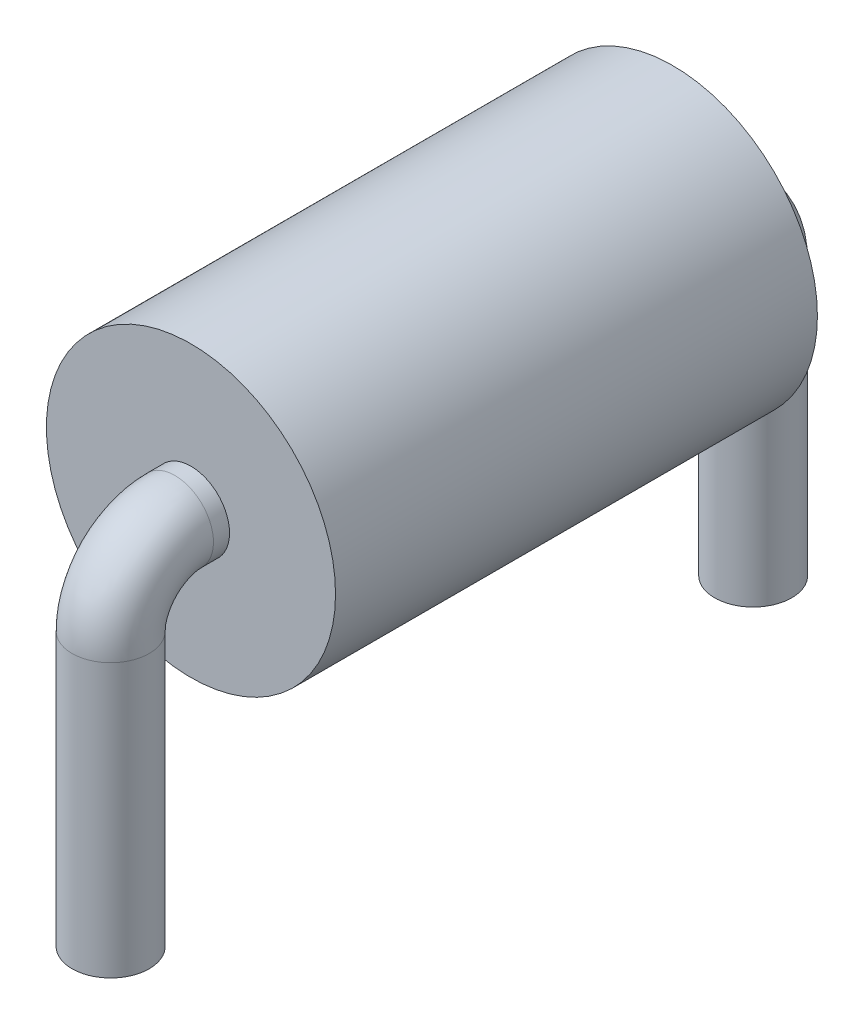
ISO-10303-21;
HEADER;
FILE_DESCRIPTION(('STEP AP214'),'2;1');
FILE_NAME('part.step','',(''),(''),'','','');
FILE_SCHEMA(('AUTOMOTIVE_DESIGN { 1 0 10303 214 1 1 1 1 }'));
ENDSEC;
DATA;
#1=APPLICATION_CONTEXT('core data for automotive mechanical design processes');
#2=APPLICATION_PROTOCOL_DEFINITION('international standard','automotive_design',2000,#1);
#3=PRODUCT_CONTEXT('',#1,'mechanical');
#4=PRODUCT('Part','Part','',(#3));
#5=PRODUCT_RELATED_PRODUCT_CATEGORY('part','',(#4));
#6=PRODUCT_DEFINITION_FORMATION('','',#4);
#7=PRODUCT_DEFINITION_CONTEXT('part definition',#1,'design');
#8=PRODUCT_DEFINITION('design','',#6,#7);
#9=PRODUCT_DEFINITION_SHAPE('','',#8);
#10=(LENGTH_UNIT() NAMED_UNIT(*) SI_UNIT(.MILLI.,.METRE.));
#11=(NAMED_UNIT(*) PLANE_ANGLE_UNIT() SI_UNIT($,.RADIAN.));
#12=(NAMED_UNIT(*) SI_UNIT($,.STERADIAN.) SOLID_ANGLE_UNIT());
#13=UNCERTAINTY_MEASURE_WITH_UNIT(LENGTH_MEASURE(1.E-05),#10,'distance_accuracy_value','');
#14=(GEOMETRIC_REPRESENTATION_CONTEXT(3) GLOBAL_UNCERTAINTY_ASSIGNED_CONTEXT((#13)) GLOBAL_UNIT_ASSIGNED_CONTEXT((#10,
#11,#12)) REPRESENTATION_CONTEXT('',''));
#15=CARTESIAN_POINT('',(0.,0.,0.));
#16=DIRECTION('',(0.,0.,1.));
#17=DIRECTION('',(1.,0.,0.));
#18=AXIS2_PLACEMENT_3D('',#15,#16,#17);
#19=CARTESIAN_POINT('',(0.,-5.25,-5.));
#20=DIRECTION('',(0.,1.,0.));
#21=DIRECTION('',(0.,0.,1.));
#22=AXIS2_PLACEMENT_3D('',#19,#20,#21);
#23=CYLINDRICAL_SURFACE('',#22,0.6);
#24=CARTESIAN_POINT('',(0.,-5.25,-5.));
#25=DIRECTION('',(0.,-1.,0.));
#26=DIRECTION('',(0.,0.,-1.));
#27=AXIS2_PLACEMENT_3D('',#24,#25,#26);
#28=CIRCLE('',#27,0.6);
#29=CARTESIAN_POINT('',(0.,-5.25,-5.6));
#30=VERTEX_POINT('',#29);
#31=EDGE_CURVE('E10',#30,#30,#28,.T.);
#32=ORIENTED_EDGE('',*,*,#31,.F.);
#33=EDGE_LOOP('',(#32));
#34=FACE_BOUND('',#33,.T.);
#35=CARTESIAN_POINT('',(0.,-1.,-5.));
#36=DIRECTION('',(0.,-1.,0.));
#37=DIRECTION('',(-1.,0.,0.));
#38=AXIS2_PLACEMENT_3D('',#35,#36,#37);
#39=CIRCLE('',#38,0.6);
#40=CARTESIAN_POINT('',(0.,-1.,-5.6));
#41=VERTEX_POINT('',#40);
#42=EDGE_CURVE('E39',#41,#41,#39,.T.);
#43=ORIENTED_EDGE('',*,*,#42,.T.);
#44=EDGE_LOOP('',(#43));
#45=FACE_BOUND('',#44,.T.);
#46=ADVANCED_FACE('F33',(#34,#45),#23,.T.);
#47=CARTESIAN_POINT('',(0.,-5.25,-5.));
#48=DIRECTION('',(0.,-1.,0.));
#49=DIRECTION('',(0.,0.,-1.));
#50=AXIS2_PLACEMENT_3D('',#47,#48,#49);
#51=PLANE('',#50);
#52=ORIENTED_EDGE('',*,*,#31,.T.);
#53=EDGE_LOOP('',(#52));
#54=FACE_BOUND('',#53,.T.);
#55=ADVANCED_FACE('F92',(#54),#51,.T.);
#56=CARTESIAN_POINT('',(0.,0.,-3.75));
#57=DIRECTION('',(0.,0.,-1.));
#58=DIRECTION('',(-1.,0.,0.));
#59=AXIS2_PLACEMENT_3D('',#56,#57,#58);
#60=CYLINDRICAL_SURFACE('',#59,0.6);
#61=CARTESIAN_POINT('',(0.,0.,-4.));
#62=DIRECTION('',(0.,0.,-1.));
#63=DIRECTION('',(-1.,0.,0.));
#64=AXIS2_PLACEMENT_3D('',#61,#62,#63);
#65=CIRCLE('',#64,0.6);
#66=CARTESIAN_POINT('',(0.,0.6,-4.));
#67=VERTEX_POINT('',#66);
#68=EDGE_CURVE('E43',#67,#67,#65,.T.);
#69=ORIENTED_EDGE('',*,*,#68,.F.);
#70=EDGE_LOOP('',(#69));
#71=FACE_BOUND('',#70,.T.);
#72=CARTESIAN_POINT('',(0.,0.,-3.75));
#73=DIRECTION('',(0.,0.,-1.));
#74=DIRECTION('',(-1.,0.,0.));
#75=AXIS2_PLACEMENT_3D('',#72,#73,#74);
#76=CIRCLE('',#75,0.6);
#77=CARTESIAN_POINT('',(-0.6,0.,-3.75));
#78=VERTEX_POINT('',#77);
#79=EDGE_CURVE('E47',#78,#78,#76,.T.);
#80=ORIENTED_EDGE('',*,*,#79,.T.);
#81=EDGE_LOOP('',(#80));
#82=FACE_BOUND('',#81,.T.);
#83=ADVANCED_FACE('F97',(#71,#82),#60,.T.);
#84=CARTESIAN_POINT('',(0.,-1.,-4.));
#85=DIRECTION('',(-1.,0.,0.));
#86=DIRECTION('',(0.,0.,1.));
#87=AXIS2_PLACEMENT_3D('',#84,#85,#86);
#88=TOROIDAL_SURFACE('',#87,1.,0.6);
#89=CARTESIAN_POINT('',(0.,-1.,-4.));
#90=DIRECTION('',(-1.,0.,0.));
#91=DIRECTION('',(0.,0.,1.));
#92=AXIS2_PLACEMENT_3D('',#89,#90,#91);
#93=CIRCLE('',#92,1.6);
#94=EDGE_CURVE('',#67,#41,#93,.T.);
#95=ORIENTED_EDGE('',*,*,#68,.T.);
#96=ORIENTED_EDGE('',*,*,#42,.F.);
#97=ORIENTED_EDGE('',*,*,#94,.T.);
#98=ORIENTED_EDGE('',*,*,#94,.F.);
#99=EDGE_LOOP('',(#95,#97,#96,#98));
#100=FACE_BOUND('',#99,.T.);
#101=ADVANCED_FACE('F98',(#100),#88,.T.);
#102=CARTESIAN_POINT('',(0.,0.,3.75));
#103=DIRECTION('',(0.,0.,-1.));
#104=DIRECTION('',(-1.,0.,0.));
#105=AXIS2_PLACEMENT_3D('',#102,#103,#104);
#106=CYLINDRICAL_SURFACE('',#105,2.25);
#107=CARTESIAN_POINT('',(0.,0.,3.75));
#108=DIRECTION('',(0.,0.,1.));
#109=DIRECTION('',(1.,0.,0.));
#110=AXIS2_PLACEMENT_3D('',#107,#108,#109);
#111=CIRCLE('',#110,2.25);
#112=CARTESIAN_POINT('',(2.25,0.,3.75));
#113=VERTEX_POINT('',#112);
#114=EDGE_CURVE('E56',#113,#113,#111,.T.);
#115=ORIENTED_EDGE('',*,*,#114,.F.);
#116=EDGE_LOOP('',(#115));
#117=FACE_BOUND('',#116,.T.);
#118=CARTESIAN_POINT('',(0.,0.,-3.75));
#119=DIRECTION('',(0.,0.,1.));
#120=DIRECTION('',(1.,0.,0.));
#121=AXIS2_PLACEMENT_3D('',#118,#119,#120);
#122=CIRCLE('',#121,2.25);
#123=CARTESIAN_POINT('',(2.25,0.,-3.75));
#124=VERTEX_POINT('',#123);
#125=EDGE_CURVE('E53',#124,#124,#122,.T.);
#126=ORIENTED_EDGE('',*,*,#125,.T.);
#127=EDGE_LOOP('',(#126));
#128=FACE_BOUND('',#127,.T.);
#129=ADVANCED_FACE('F104',(#117,#128),#106,.T.);
#130=CARTESIAN_POINT('',(0.,0.,3.75));
#131=DIRECTION('',(0.,0.,1.));
#132=DIRECTION('',(1.,0.,0.));
#133=AXIS2_PLACEMENT_3D('',#130,#131,#132);
#134=PLANE('',#133);
#135=CARTESIAN_POINT('',(0.,0.,3.75));
#136=DIRECTION('',(0.,0.,1.));
#137=DIRECTION('',(1.,0.,0.));
#138=AXIS2_PLACEMENT_3D('',#135,#136,#137);
#139=CIRCLE('',#138,0.6);
#140=CARTESIAN_POINT('',(0.6,0.,3.75));
#141=VERTEX_POINT('',#140);
#142=EDGE_CURVE('E52',#141,#141,#139,.T.);
#143=ORIENTED_EDGE('',*,*,#142,.F.);
#144=EDGE_LOOP('',(#143));
#145=FACE_BOUND('',#144,.T.);
#146=ORIENTED_EDGE('',*,*,#114,.T.);
#147=EDGE_LOOP('',(#146));
#148=FACE_BOUND('',#147,.T.);
#149=ADVANCED_FACE('F86',(#145,#148),#134,.T.);
#150=CARTESIAN_POINT('',(0.,0.,-3.75));
#151=DIRECTION('',(0.,0.,1.));
#152=DIRECTION('',(1.,0.,0.));
#153=AXIS2_PLACEMENT_3D('',#150,#151,#152);
#154=PLANE('',#153);
#155=ORIENTED_EDGE('',*,*,#79,.F.);
#156=EDGE_LOOP('',(#155));
#157=FACE_BOUND('',#156,.T.);
#158=ORIENTED_EDGE('',*,*,#125,.F.);
#159=EDGE_LOOP('',(#158));
#160=FACE_BOUND('',#159,.T.);
#161=ADVANCED_FACE('F76',(#157,#160),#154,.F.);
#162=CARTESIAN_POINT('',(0.,-3.42215390876568,5.));
#163=DIRECTION('',(0.,1.,0.));
#164=DIRECTION('',(0.,0.,1.));
#165=AXIS2_PLACEMENT_3D('',#162,#163,#164);
#166=CYLINDRICAL_SURFACE('',#165,0.6);
#167=CARTESIAN_POINT('',(0.,-1.,5.));
#168=DIRECTION('',(0.,-1.,0.));
#169=DIRECTION('',(1.,0.,0.));
#170=AXIS2_PLACEMENT_3D('',#167,#168,#169);
#171=CIRCLE('',#170,0.6);
#172=CARTESIAN_POINT('',(0.,-1.,5.6));
#173=VERTEX_POINT('',#172);
#174=EDGE_CURVE('E64',#173,#173,#171,.T.);
#175=ORIENTED_EDGE('',*,*,#174,.T.);
#176=EDGE_LOOP('',(#175));
#177=FACE_BOUND('',#176,.T.);
#178=CARTESIAN_POINT('',(0.,-5.25,5.));
#179=DIRECTION('',(0.,-1.,0.));
#180=DIRECTION('',(0.,0.,-1.));
#181=AXIS2_PLACEMENT_3D('',#178,#179,#180);
#182=CIRCLE('',#181,0.6);
#183=CARTESIAN_POINT('',(0.,-5.25,4.4));
#184=VERTEX_POINT('',#183);
#185=EDGE_CURVE('E67',#184,#184,#182,.T.);
#186=ORIENTED_EDGE('',*,*,#185,.F.);
#187=EDGE_LOOP('',(#186));
#188=FACE_BOUND('',#187,.T.);
#189=ADVANCED_FACE('F73',(#177,#188),#166,.T.);
#190=CARTESIAN_POINT('',(0.,-1.,4.));
#191=DIRECTION('',(-1.,0.,0.));
#192=DIRECTION('',(0.,0.,1.));
#193=AXIS2_PLACEMENT_3D('',#190,#191,#192);
#194=TOROIDAL_SURFACE('',#193,1.,0.6);
#195=CARTESIAN_POINT('',(0.,0.,4.));
#196=DIRECTION('',(0.,0.,1.));
#197=DIRECTION('',(1.,0.,0.));
#198=AXIS2_PLACEMENT_3D('',#195,#196,#197);
#199=CIRCLE('',#198,0.6);
#200=CARTESIAN_POINT('',(0.,0.600000000000001,4.));
#201=VERTEX_POINT('',#200);
#202=EDGE_CURVE('E57',#201,#201,#199,.T.);
#203=CARTESIAN_POINT('',(0.,-1.,4.));
#204=DIRECTION('',(-1.,0.,0.));
#205=DIRECTION('',(0.,0.,1.));
#206=AXIS2_PLACEMENT_3D('',#203,#204,#205);
#207=CIRCLE('',#206,1.6);
#208=EDGE_CURVE('',#173,#201,#207,.T.);
#209=ORIENTED_EDGE('',*,*,#174,.F.);
#210=ORIENTED_EDGE('',*,*,#202,.T.);
#211=ORIENTED_EDGE('',*,*,#208,.T.);
#212=ORIENTED_EDGE('',*,*,#208,.F.);
#213=EDGE_LOOP('',(#209,#211,#210,#212));
#214=FACE_BOUND('',#213,.T.);
#215=ADVANCED_FACE('F75',(#214),#194,.T.);
#216=CARTESIAN_POINT('',(0.,0.,4.));
#217=DIRECTION('',(0.,0.,-1.));
#218=DIRECTION('',(-1.,0.,0.));
#219=AXIS2_PLACEMENT_3D('',#216,#217,#218);
#220=CYLINDRICAL_SURFACE('',#219,0.6);
#221=ORIENTED_EDGE('',*,*,#142,.T.);
#222=EDGE_LOOP('',(#221));
#223=FACE_BOUND('',#222,.T.);
#224=ORIENTED_EDGE('',*,*,#202,.F.);
#225=EDGE_LOOP('',(#224));
#226=FACE_BOUND('',#225,.T.);
#227=ADVANCED_FACE('F83',(#223,#226),#220,.T.);
#228=CARTESIAN_POINT('',(0.,-5.25,5.));
#229=DIRECTION('',(0.,-1.,0.));
#230=DIRECTION('',(0.,0.,-1.));
#231=AXIS2_PLACEMENT_3D('',#228,#229,#230);
#232=PLANE('',#231);
#233=ORIENTED_EDGE('',*,*,#185,.T.);
#234=EDGE_LOOP('',(#233));
#235=FACE_BOUND('',#234,.T.);
#236=ADVANCED_FACE('F71',(#235),#232,.T.);
#237=CLOSED_SHELL('',(#46,#55,#83,#101,#129,#149,#161,#189,#215,#227,#236));
#238=MANIFOLD_SOLID_BREP('B2',#237);
#239=ADVANCED_BREP_SHAPE_REPRESENTATION('',(#18,#238),#14);
#240=SHAPE_DEFINITION_REPRESENTATION(#9,#239);
ENDSEC;
END-ISO-10303-21;
